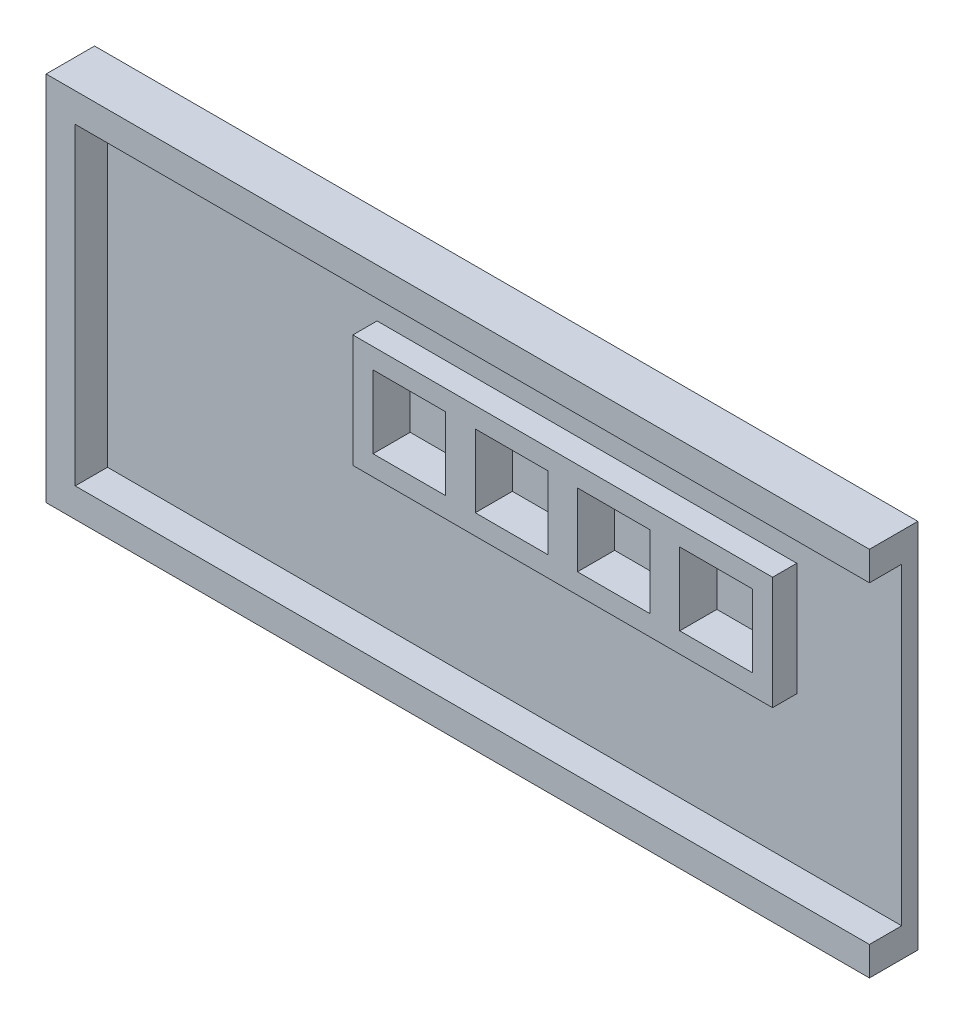
ISO-10303-21;
HEADER;
FILE_DESCRIPTION(('STEP AP214'),'2;1');
FILE_NAME('part.step','',(''),(''),'','','');
FILE_SCHEMA(('AUTOMOTIVE_DESIGN { 1 0 10303 214 1 1 1 1 }'));
ENDSEC;
DATA;
#1=APPLICATION_CONTEXT('core data for automotive mechanical design processes');
#2=APPLICATION_PROTOCOL_DEFINITION('international standard','automotive_design',2000,#1);
#3=PRODUCT_CONTEXT('',#1,'mechanical');
#4=PRODUCT('Part','Part','',(#3));
#5=PRODUCT_RELATED_PRODUCT_CATEGORY('part','',(#4));
#6=PRODUCT_DEFINITION_FORMATION('','',#4);
#7=PRODUCT_DEFINITION_CONTEXT('part definition',#1,'design');
#8=PRODUCT_DEFINITION('design','',#6,#7);
#9=PRODUCT_DEFINITION_SHAPE('','',#8);
#10=(LENGTH_UNIT() NAMED_UNIT(*) SI_UNIT(.MILLI.,.METRE.));
#11=(NAMED_UNIT(*) PLANE_ANGLE_UNIT() SI_UNIT($,.RADIAN.));
#12=(NAMED_UNIT(*) SI_UNIT($,.STERADIAN.) SOLID_ANGLE_UNIT());
#13=UNCERTAINTY_MEASURE_WITH_UNIT(LENGTH_MEASURE(1.E-05),#10,'distance_accuracy_value','');
#14=(GEOMETRIC_REPRESENTATION_CONTEXT(3) GLOBAL_UNCERTAINTY_ASSIGNED_CONTEXT((#13)) GLOBAL_UNIT_ASSIGNED_CONTEXT((#10,
#11,#12)) REPRESENTATION_CONTEXT('',''));
#15=CARTESIAN_POINT('',(0.,0.,0.));
#16=DIRECTION('',(0.,0.,1.));
#17=DIRECTION('',(1.,0.,0.));
#18=AXIS2_PLACEMENT_3D('',#15,#16,#17);
#19=CARTESIAN_POINT('',(0.,0.,1.));
#20=DIRECTION('',(0.,0.,1.));
#21=DIRECTION('',(1.,0.,0.));
#22=AXIS2_PLACEMENT_3D('',#19,#20,#21);
#23=PLANE('',#22);
#24=DIRECTION('',(1.,0.,0.));
#25=VECTOR('',#24,1.);
#26=CARTESIAN_POINT('',(-49.2,21.2,1.));
#27=LINE('',#26,#25);
#28=CARTESIAN_POINT('',(-49.2,21.2,1.));
#29=VERTEX_POINT('',#28);
#30=CARTESIAN_POINT('',(0.,21.2,1.));
#31=VERTEX_POINT('',#30);
#32=EDGE_CURVE('E386',#29,#31,#27,.T.);
#33=ORIENTED_EDGE('',*,*,#32,.F.);
#34=DIRECTION('',(0.,1.,0.));
#35=VECTOR('',#34,1.);
#36=CARTESIAN_POINT('',(-49.2,21.2,1.));
#37=LINE('',#36,#35);
#38=CARTESIAN_POINT('',(-49.2,1.8,1.));
#39=VERTEX_POINT('',#38);
#40=EDGE_CURVE('E406',#39,#29,#37,.T.);
#41=ORIENTED_EDGE('',*,*,#40,.F.);
#42=DIRECTION('',(-1.,0.,0.));
#43=VECTOR('',#42,1.);
#44=CARTESIAN_POINT('',(-49.2,1.8,1.));
#45=LINE('',#44,#43);
#46=CARTESIAN_POINT('',(0.,1.8,1.));
#47=VERTEX_POINT('',#46);
#48=EDGE_CURVE('E381',#47,#39,#45,.T.);
#49=ORIENTED_EDGE('',*,*,#48,.F.);
#50=DIRECTION('',(0.,1.,0.));
#51=VECTOR('',#50,1.);
#52=CARTESIAN_POINT('',(0.,0.,1.));
#53=LINE('',#52,#51);
#54=EDGE_CURVE('E423',#47,#31,#53,.T.);
#55=ORIENTED_EDGE('',*,*,#54,.T.);
#56=EDGE_LOOP('',(#33,#41,#49,#55));
#57=FACE_BOUND('',#56,.T.);
#58=DIRECTION('',(1.,0.,0.));
#59=VECTOR('',#58,1.);
#60=CARTESIAN_POINT('',(-32.5,11.,1.));
#61=LINE('',#60,#59);
#62=CARTESIAN_POINT('',(-32.5,11.,1.));
#63=VERTEX_POINT('',#62);
#64=CARTESIAN_POINT('',(-6.5,11.,1.));
#65=VERTEX_POINT('',#64);
#66=EDGE_CURVE('E366',#63,#65,#61,.T.);
#67=ORIENTED_EDGE('',*,*,#66,.F.);
#68=DIRECTION('',(0.,-1.,0.));
#69=VECTOR('',#68,1.);
#70=CARTESIAN_POINT('',(-32.5,18.,1.));
#71=LINE('',#70,#69);
#72=CARTESIAN_POINT('',(-32.5,18.,1.));
#73=VERTEX_POINT('',#72);
#74=EDGE_CURVE('E346',#73,#63,#71,.T.);
#75=ORIENTED_EDGE('',*,*,#74,.F.);
#76=DIRECTION('',(-1.,0.,0.));
#77=VECTOR('',#76,1.);
#78=CARTESIAN_POINT('',(-32.5,18.,1.));
#79=LINE('',#78,#77);
#80=CARTESIAN_POINT('',(-6.5,18.,1.));
#81=VERTEX_POINT('',#80);
#82=EDGE_CURVE('E357',#81,#73,#79,.T.);
#83=ORIENTED_EDGE('',*,*,#82,.F.);
#84=DIRECTION('',(0.,1.,0.));
#85=VECTOR('',#84,1.);
#86=CARTESIAN_POINT('',(-6.5,18.,1.));
#87=LINE('',#86,#85);
#88=EDGE_CURVE('E368',#65,#81,#87,.T.);
#89=ORIENTED_EDGE('',*,*,#88,.F.);
#90=EDGE_LOOP('',(#67,#75,#83,#89));
#91=FACE_BOUND('',#90,.T.);
#92=ADVANCED_FACE('F35',(#57,#91),#23,.T.);
#93=CARTESIAN_POINT('',(0.,0.,1.));
#94=DIRECTION('',(-1.,0.,0.));
#95=DIRECTION('',(0.,0.,1.));
#96=AXIS2_PLACEMENT_3D('',#93,#94,#95);
#97=PLANE('',#96);
#98=DIRECTION('',(0.,1.,0.));
#99=VECTOR('',#98,1.);
#100=CARTESIAN_POINT('',(0.,0.,0.));
#101=LINE('',#100,#99);
#102=CARTESIAN_POINT('',(0.,0.,0.));
#103=VERTEX_POINT('',#102);
#104=CARTESIAN_POINT('',(0.,23.,0.));
#105=VERTEX_POINT('',#104);
#106=EDGE_CURVE('E422',#103,#105,#101,.T.);
#107=ORIENTED_EDGE('',*,*,#106,.T.);
#108=DIRECTION('',(0.,0.,-1.));
#109=VECTOR('',#108,1.);
#110=CARTESIAN_POINT('',(0.,23.,1.));
#111=LINE('',#110,#109);
#112=CARTESIAN_POINT('',(0.,23.,3.));
#113=VERTEX_POINT('',#112);
#114=EDGE_CURVE('E11',#113,#105,#111,.T.);
#115=ORIENTED_EDGE('',*,*,#114,.F.);
#116=DIRECTION('',(0.,1.,0.));
#117=VECTOR('',#116,1.);
#118=CARTESIAN_POINT('',(0.,23.,3.));
#119=LINE('',#118,#117);
#120=CARTESIAN_POINT('',(0.,21.2,3.));
#121=VERTEX_POINT('',#120);
#122=EDGE_CURVE('E397',#121,#113,#119,.T.);
#123=ORIENTED_EDGE('',*,*,#122,.F.);
#124=DIRECTION('',(0.,0.,-1.));
#125=VECTOR('',#124,1.);
#126=CARTESIAN_POINT('',(0.,21.2,3.));
#127=LINE('',#126,#125);
#128=EDGE_CURVE('E403',#121,#31,#127,.T.);
#129=ORIENTED_EDGE('',*,*,#128,.T.);
#130=ORIENTED_EDGE('',*,*,#54,.F.);
#131=DIRECTION('',(0.,0.,-1.));
#132=VECTOR('',#131,1.);
#133=CARTESIAN_POINT('',(0.,1.8,3.));
#134=LINE('',#133,#132);
#135=CARTESIAN_POINT('',(0.,1.8,3.));
#136=VERTEX_POINT('',#135);
#137=EDGE_CURVE('E419',#136,#47,#134,.T.);
#138=ORIENTED_EDGE('',*,*,#137,.F.);
#139=DIRECTION('',(0.,1.,0.));
#140=VECTOR('',#139,1.);
#141=CARTESIAN_POINT('',(0.,0.,3.));
#142=LINE('',#141,#140);
#143=CARTESIAN_POINT('',(0.,0.,3.));
#144=VERTEX_POINT('',#143);
#145=EDGE_CURVE('E389',#144,#136,#142,.T.);
#146=ORIENTED_EDGE('',*,*,#145,.F.);
#147=DIRECTION('',(0.,0.,-1.));
#148=VECTOR('',#147,1.);
#149=CARTESIAN_POINT('',(0.,0.,1.));
#150=LINE('',#149,#148);
#151=EDGE_CURVE('E425',#144,#103,#150,.T.);
#152=ORIENTED_EDGE('',*,*,#151,.T.);
#153=EDGE_LOOP('',(#107,#115,#123,#129,#130,#138,#146,#152));
#154=FACE_BOUND('',#153,.T.);
#155=ADVANCED_FACE('F37',(#154),#97,.F.);
#156=CARTESIAN_POINT('',(0.,23.,1.));
#157=DIRECTION('',(0.,-1.,0.));
#158=DIRECTION('',(0.,0.,-1.));
#159=AXIS2_PLACEMENT_3D('',#156,#157,#158);
#160=PLANE('',#159);
#161=DIRECTION('',(-1.,0.,0.));
#162=VECTOR('',#161,1.);
#163=CARTESIAN_POINT('',(0.,23.,0.));
#164=LINE('',#163,#162);
#165=CARTESIAN_POINT('',(-51.,23.,0.));
#166=VERTEX_POINT('',#165);
#167=EDGE_CURVE('E429',#105,#166,#164,.T.);
#168=ORIENTED_EDGE('',*,*,#167,.T.);
#169=DIRECTION('',(0.,0.,-1.));
#170=VECTOR('',#169,1.);
#171=CARTESIAN_POINT('',(-51.,23.,1.));
#172=LINE('',#171,#170);
#173=CARTESIAN_POINT('',(-51.,23.,3.));
#174=VERTEX_POINT('',#173);
#175=EDGE_CURVE('E43',#174,#166,#172,.T.);
#176=ORIENTED_EDGE('',*,*,#175,.F.);
#177=DIRECTION('',(-1.,0.,0.));
#178=VECTOR('',#177,1.);
#179=CARTESIAN_POINT('',(-51.,23.,3.));
#180=LINE('',#179,#178);
#181=EDGE_CURVE('E400',#113,#174,#180,.T.);
#182=ORIENTED_EDGE('',*,*,#181,.F.);
#183=ORIENTED_EDGE('',*,*,#114,.T.);
#184=EDGE_LOOP('',(#168,#176,#182,#183));
#185=FACE_BOUND('',#184,.T.);
#186=ADVANCED_FACE('F461',(#185),#160,.F.);
#187=CARTESIAN_POINT('',(-51.,0.,1.));
#188=DIRECTION('',(1.,0.,0.));
#189=DIRECTION('',(0.,0.,-1.));
#190=AXIS2_PLACEMENT_3D('',#187,#188,#189);
#191=PLANE('',#190);
#192=DIRECTION('',(0.,-1.,0.));
#193=VECTOR('',#192,1.);
#194=CARTESIAN_POINT('',(-51.,0.,0.));
#195=LINE('',#194,#193);
#196=CARTESIAN_POINT('',(-51.,0.,0.));
#197=VERTEX_POINT('',#196);
#198=EDGE_CURVE('E431',#166,#197,#195,.T.);
#199=ORIENTED_EDGE('',*,*,#198,.T.);
#200=DIRECTION('',(0.,0.,-1.));
#201=VECTOR('',#200,1.);
#202=CARTESIAN_POINT('',(-51.,0.,1.));
#203=LINE('',#202,#201);
#204=CARTESIAN_POINT('',(-51.,0.,3.));
#205=VERTEX_POINT('',#204);
#206=EDGE_CURVE('E436',#205,#197,#203,.T.);
#207=ORIENTED_EDGE('',*,*,#206,.F.);
#208=DIRECTION('',(0.,-1.,0.));
#209=VECTOR('',#208,1.);
#210=CARTESIAN_POINT('',(-51.,23.,3.));
#211=LINE('',#210,#209);
#212=EDGE_CURVE('E382',#174,#205,#211,.T.);
#213=ORIENTED_EDGE('',*,*,#212,.F.);
#214=ORIENTED_EDGE('',*,*,#175,.T.);
#215=EDGE_LOOP('',(#199,#207,#213,#214));
#216=FACE_BOUND('',#215,.T.);
#217=ADVANCED_FACE('F442',(#216),#191,.F.);
#218=CARTESIAN_POINT('',(0.,0.,1.));
#219=DIRECTION('',(0.,1.,0.));
#220=DIRECTION('',(0.,0.,1.));
#221=AXIS2_PLACEMENT_3D('',#218,#219,#220);
#222=PLANE('',#221);
#223=DIRECTION('',(1.,0.,0.));
#224=VECTOR('',#223,1.);
#225=CARTESIAN_POINT('',(0.,0.,0.));
#226=LINE('',#225,#224);
#227=EDGE_CURVE('E426',#197,#103,#226,.T.);
#228=ORIENTED_EDGE('',*,*,#227,.T.);
#229=ORIENTED_EDGE('',*,*,#151,.F.);
#230=DIRECTION('',(1.,0.,0.));
#231=VECTOR('',#230,1.);
#232=CARTESIAN_POINT('',(-51.,0.,3.));
#233=LINE('',#232,#231);
#234=EDGE_CURVE('E385',#205,#144,#233,.T.);
#235=ORIENTED_EDGE('',*,*,#234,.F.);
#236=ORIENTED_EDGE('',*,*,#206,.T.);
#237=EDGE_LOOP('',(#228,#229,#235,#236));
#238=FACE_BOUND('',#237,.T.);
#239=ADVANCED_FACE('F450',(#238),#222,.F.);
#240=CARTESIAN_POINT('',(0.,0.,0.));
#241=DIRECTION('',(0.,0.,1.));
#242=DIRECTION('',(1.,0.,0.));
#243=AXIS2_PLACEMENT_3D('',#240,#241,#242);
#244=PLANE('',#243);
#245=ORIENTED_EDGE('',*,*,#106,.F.);
#246=ORIENTED_EDGE('',*,*,#227,.F.);
#247=ORIENTED_EDGE('',*,*,#198,.F.);
#248=ORIENTED_EDGE('',*,*,#167,.F.);
#249=EDGE_LOOP('',(#245,#246,#247,#248));
#250=FACE_BOUND('',#249,.T.);
#251=ADVANCED_FACE('F448',(#250),#244,.F.);
#252=CARTESIAN_POINT('',(-49.2,1.8,3.));
#253=DIRECTION('',(0.,-1.,0.));
#254=DIRECTION('',(0.,0.,-1.));
#255=AXIS2_PLACEMENT_3D('',#252,#253,#254);
#256=PLANE('',#255);
#257=ORIENTED_EDGE('',*,*,#48,.T.);
#258=DIRECTION('',(0.,0.,-1.));
#259=VECTOR('',#258,1.);
#260=CARTESIAN_POINT('',(-49.2,1.8,3.));
#261=LINE('',#260,#259);
#262=CARTESIAN_POINT('',(-49.2,1.8,3.));
#263=VERTEX_POINT('',#262);
#264=EDGE_CURVE('E416',#263,#39,#261,.T.);
#265=ORIENTED_EDGE('',*,*,#264,.F.);
#266=DIRECTION('',(-1.,0.,0.));
#267=VECTOR('',#266,1.);
#268=CARTESIAN_POINT('',(-49.2,1.8,3.));
#269=LINE('',#268,#267);
#270=EDGE_CURVE('E391',#136,#263,#269,.T.);
#271=ORIENTED_EDGE('',*,*,#270,.F.);
#272=ORIENTED_EDGE('',*,*,#137,.T.);
#273=EDGE_LOOP('',(#257,#265,#271,#272));
#274=FACE_BOUND('',#273,.T.);
#275=ADVANCED_FACE('F473',(#274),#256,.F.);
#276=CARTESIAN_POINT('',(-49.2,21.2,3.));
#277=DIRECTION('',(-1.,0.,0.));
#278=DIRECTION('',(0.,0.,1.));
#279=AXIS2_PLACEMENT_3D('',#276,#277,#278);
#280=PLANE('',#279);
#281=ORIENTED_EDGE('',*,*,#40,.T.);
#282=DIRECTION('',(0.,0.,-1.));
#283=VECTOR('',#282,1.);
#284=CARTESIAN_POINT('',(-49.2,21.2,3.));
#285=LINE('',#284,#283);
#286=CARTESIAN_POINT('',(-49.2,21.2,3.));
#287=VERTEX_POINT('',#286);
#288=EDGE_CURVE('E413',#287,#29,#285,.T.);
#289=ORIENTED_EDGE('',*,*,#288,.F.);
#290=DIRECTION('',(0.,1.,0.));
#291=VECTOR('',#290,1.);
#292=CARTESIAN_POINT('',(-49.2,21.2,3.));
#293=LINE('',#292,#291);
#294=EDGE_CURVE('E393',#263,#287,#293,.T.);
#295=ORIENTED_EDGE('',*,*,#294,.F.);
#296=ORIENTED_EDGE('',*,*,#264,.T.);
#297=EDGE_LOOP('',(#281,#289,#295,#296));
#298=FACE_BOUND('',#297,.T.);
#299=ADVANCED_FACE('F470',(#298),#280,.F.);
#300=CARTESIAN_POINT('',(-49.2,21.2,3.));
#301=DIRECTION('',(0.,1.,0.));
#302=DIRECTION('',(0.,0.,1.));
#303=AXIS2_PLACEMENT_3D('',#300,#301,#302);
#304=PLANE('',#303);
#305=ORIENTED_EDGE('',*,*,#32,.T.);
#306=ORIENTED_EDGE('',*,*,#128,.F.);
#307=DIRECTION('',(1.,0.,0.));
#308=VECTOR('',#307,1.);
#309=CARTESIAN_POINT('',(-49.2,21.2,3.));
#310=LINE('',#309,#308);
#311=EDGE_CURVE('E395',#287,#121,#310,.T.);
#312=ORIENTED_EDGE('',*,*,#311,.F.);
#313=ORIENTED_EDGE('',*,*,#288,.T.);
#314=EDGE_LOOP('',(#305,#306,#312,#313));
#315=FACE_BOUND('',#314,.T.);
#316=ADVANCED_FACE('F465',(#315),#304,.F.);
#317=CARTESIAN_POINT('',(0.,0.,3.));
#318=DIRECTION('',(0.,0.,1.));
#319=DIRECTION('',(1.,0.,0.));
#320=AXIS2_PLACEMENT_3D('',#317,#318,#319);
#321=PLANE('',#320);
#322=ORIENTED_EDGE('',*,*,#212,.T.);
#323=ORIENTED_EDGE('',*,*,#234,.T.);
#324=ORIENTED_EDGE('',*,*,#145,.T.);
#325=ORIENTED_EDGE('',*,*,#270,.T.);
#326=ORIENTED_EDGE('',*,*,#294,.T.);
#327=ORIENTED_EDGE('',*,*,#311,.T.);
#328=ORIENTED_EDGE('',*,*,#122,.T.);
#329=ORIENTED_EDGE('',*,*,#181,.T.);
#330=EDGE_LOOP('',(#322,#323,#324,#325,#326,#327,#328,#329));
#331=FACE_BOUND('',#330,.T.);
#332=ADVANCED_FACE('F458',(#331),#321,.T.);
#333=CARTESIAN_POINT('',(-32.5,18.,2.5));
#334=DIRECTION('',(1.,0.,0.));
#335=DIRECTION('',(0.,0.,-1.));
#336=AXIS2_PLACEMENT_3D('',#333,#334,#335);
#337=PLANE('',#336);
#338=ORIENTED_EDGE('',*,*,#74,.T.);
#339=DIRECTION('',(0.,0.,-1.));
#340=VECTOR('',#339,1.);
#341=CARTESIAN_POINT('',(-32.5,11.,2.5));
#342=LINE('',#341,#340);
#343=CARTESIAN_POINT('',(-32.5,11.,2.5));
#344=VERTEX_POINT('',#343);
#345=EDGE_CURVE('E379',#344,#63,#342,.T.);
#346=ORIENTED_EDGE('',*,*,#345,.F.);
#347=DIRECTION('',(0.,-1.,0.));
#348=VECTOR('',#347,1.);
#349=CARTESIAN_POINT('',(-32.5,18.,2.5));
#350=LINE('',#349,#348);
#351=CARTESIAN_POINT('',(-32.5,18.,2.5));
#352=VERTEX_POINT('',#351);
#353=EDGE_CURVE('E353',#352,#344,#350,.T.);
#354=ORIENTED_EDGE('',*,*,#353,.F.);
#355=DIRECTION('',(0.,0.,-1.));
#356=VECTOR('',#355,1.);
#357=CARTESIAN_POINT('',(-32.5,18.,2.5));
#358=LINE('',#357,#356);
#359=EDGE_CURVE('E363',#352,#73,#358,.T.);
#360=ORIENTED_EDGE('',*,*,#359,.T.);
#361=EDGE_LOOP('',(#338,#346,#354,#360));
#362=FACE_BOUND('',#361,.T.);
#363=ADVANCED_FACE('F563',(#362),#337,.F.);
#364=CARTESIAN_POINT('',(-32.5,11.,2.5));
#365=DIRECTION('',(0.,1.,0.));
#366=DIRECTION('',(0.,0.,1.));
#367=AXIS2_PLACEMENT_3D('',#364,#365,#366);
#368=PLANE('',#367);
#369=ORIENTED_EDGE('',*,*,#66,.T.);
#370=DIRECTION('',(0.,0.,-1.));
#371=VECTOR('',#370,1.);
#372=CARTESIAN_POINT('',(-6.5,11.,2.5));
#373=LINE('',#372,#371);
#374=CARTESIAN_POINT('',(-6.5,11.,2.5));
#375=VERTEX_POINT('',#374);
#376=EDGE_CURVE('E376',#375,#65,#373,.T.);
#377=ORIENTED_EDGE('',*,*,#376,.F.);
#378=DIRECTION('',(1.,0.,0.));
#379=VECTOR('',#378,1.);
#380=CARTESIAN_POINT('',(-32.5,11.,2.5));
#381=LINE('',#380,#379);
#382=EDGE_CURVE('E356',#344,#375,#381,.T.);
#383=ORIENTED_EDGE('',*,*,#382,.F.);
#384=ORIENTED_EDGE('',*,*,#345,.T.);
#385=EDGE_LOOP('',(#369,#377,#383,#384));
#386=FACE_BOUND('',#385,.T.);
#387=ADVANCED_FACE('F575',(#386),#368,.F.);
#388=CARTESIAN_POINT('',(-6.5,18.,2.5));
#389=DIRECTION('',(-1.,0.,0.));
#390=DIRECTION('',(0.,0.,1.));
#391=AXIS2_PLACEMENT_3D('',#388,#389,#390);
#392=PLANE('',#391);
#393=ORIENTED_EDGE('',*,*,#88,.T.);
#394=DIRECTION('',(0.,0.,-1.));
#395=VECTOR('',#394,1.);
#396=CARTESIAN_POINT('',(-6.5,18.,2.5));
#397=LINE('',#396,#395);
#398=CARTESIAN_POINT('',(-6.5,18.,2.5));
#399=VERTEX_POINT('',#398);
#400=EDGE_CURVE('E374',#399,#81,#397,.T.);
#401=ORIENTED_EDGE('',*,*,#400,.F.);
#402=DIRECTION('',(0.,1.,0.));
#403=VECTOR('',#402,1.);
#404=CARTESIAN_POINT('',(-6.5,18.,2.5));
#405=LINE('',#404,#403);
#406=EDGE_CURVE('E359',#375,#399,#405,.T.);
#407=ORIENTED_EDGE('',*,*,#406,.F.);
#408=ORIENTED_EDGE('',*,*,#376,.T.);
#409=EDGE_LOOP('',(#393,#401,#407,#408));
#410=FACE_BOUND('',#409,.T.);
#411=ADVANCED_FACE('F584',(#410),#392,.F.);
#412=CARTESIAN_POINT('',(-32.5,18.,2.5));
#413=DIRECTION('',(0.,-1.,0.));
#414=DIRECTION('',(0.,0.,-1.));
#415=AXIS2_PLACEMENT_3D('',#412,#413,#414);
#416=PLANE('',#415);
#417=ORIENTED_EDGE('',*,*,#82,.T.);
#418=ORIENTED_EDGE('',*,*,#359,.F.);
#419=DIRECTION('',(-1.,0.,0.));
#420=VECTOR('',#419,1.);
#421=CARTESIAN_POINT('',(-32.5,18.,2.5));
#422=LINE('',#421,#420);
#423=EDGE_CURVE('E361',#399,#352,#422,.T.);
#424=ORIENTED_EDGE('',*,*,#423,.F.);
#425=ORIENTED_EDGE('',*,*,#400,.T.);
#426=EDGE_LOOP('',(#417,#418,#424,#425));
#427=FACE_BOUND('',#426,.T.);
#428=ADVANCED_FACE('F593',(#427),#416,.F.);
#429=CARTESIAN_POINT('',(0.,0.,2.5));
#430=DIRECTION('',(0.,0.,1.));
#431=DIRECTION('',(1.,0.,0.));
#432=AXIS2_PLACEMENT_3D('',#429,#430,#431);
#433=PLANE('',#432);
#434=DIRECTION('',(0.,-1.,0.));
#435=VECTOR('',#434,1.);
#436=CARTESIAN_POINT('',(-24.9166666666667,16.75,2.5));
#437=LINE('',#436,#435);
#438=CARTESIAN_POINT('',(-24.9166666666667,16.75,2.5));
#439=VERTEX_POINT('',#438);
#440=CARTESIAN_POINT('',(-24.9166666666667,12.25,2.5));
#441=VERTEX_POINT('',#440);
#442=EDGE_CURVE('E50',#439,#441,#437,.T.);
#443=ORIENTED_EDGE('',*,*,#442,.F.);
#444=DIRECTION('',(-1.,0.,0.));
#445=VECTOR('',#444,1.);
#446=CARTESIAN_POINT('',(-24.9166666666667,16.75,2.5));
#447=LINE('',#446,#445);
#448=CARTESIAN_POINT('',(-20.4166666666667,16.75,2.5));
#449=VERTEX_POINT('',#448);
#450=EDGE_CURVE('E240',#449,#439,#447,.T.);
#451=ORIENTED_EDGE('',*,*,#450,.F.);
#452=DIRECTION('',(0.,1.,0.));
#453=VECTOR('',#452,1.);
#454=CARTESIAN_POINT('',(-20.4166666666667,16.75,2.5));
#455=LINE('',#454,#453);
#456=CARTESIAN_POINT('',(-20.4166666666667,12.25,2.5));
#457=VERTEX_POINT('',#456);
#458=EDGE_CURVE('E243',#457,#449,#455,.T.);
#459=ORIENTED_EDGE('',*,*,#458,.F.);
#460=DIRECTION('',(1.,0.,0.));
#461=VECTOR('',#460,1.);
#462=CARTESIAN_POINT('',(-24.9166666666667,12.25,2.5));
#463=LINE('',#462,#461);
#464=EDGE_CURVE('E249',#441,#457,#463,.T.);
#465=ORIENTED_EDGE('',*,*,#464,.F.);
#466=EDGE_LOOP('',(#443,#451,#459,#465));
#467=FACE_BOUND('',#466,.T.);
#468=DIRECTION('',(0.,-1.,0.));
#469=VECTOR('',#468,1.);
#470=CARTESIAN_POINT('',(-18.5833333333333,16.75,2.5));
#471=LINE('',#470,#469);
#472=CARTESIAN_POINT('',(-18.5833333333333,16.75,2.5));
#473=VERTEX_POINT('',#472);
#474=CARTESIAN_POINT('',(-18.5833333333333,12.25,2.5));
#475=VERTEX_POINT('',#474);
#476=EDGE_CURVE('E58',#473,#475,#471,.T.);
#477=ORIENTED_EDGE('',*,*,#476,.F.);
#478=DIRECTION('',(-1.,0.,0.));
#479=VECTOR('',#478,1.);
#480=CARTESIAN_POINT('',(-18.5833333333333,16.75,2.5));
#481=LINE('',#480,#479);
#482=CARTESIAN_POINT('',(-14.0833333333333,16.75,2.5));
#483=VERTEX_POINT('',#482);
#484=EDGE_CURVE('E264',#483,#473,#481,.T.);
#485=ORIENTED_EDGE('',*,*,#484,.F.);
#486=DIRECTION('',(0.,1.,0.));
#487=VECTOR('',#486,1.);
#488=CARTESIAN_POINT('',(-14.0833333333333,16.75,2.5));
#489=LINE('',#488,#487);
#490=CARTESIAN_POINT('',(-14.0833333333333,12.25,2.5));
#491=VERTEX_POINT('',#490);
#492=EDGE_CURVE('E279',#491,#483,#489,.T.);
#493=ORIENTED_EDGE('',*,*,#492,.F.);
#494=DIRECTION('',(1.,0.,0.));
#495=VECTOR('',#494,1.);
#496=CARTESIAN_POINT('',(-18.5833333333333,12.25,2.5));
#497=LINE('',#496,#495);
#498=EDGE_CURVE('E275',#475,#491,#497,.T.);
#499=ORIENTED_EDGE('',*,*,#498,.F.);
#500=EDGE_LOOP('',(#477,#485,#493,#499));
#501=FACE_BOUND('',#500,.T.);
#502=DIRECTION('',(0.,-1.,0.));
#503=VECTOR('',#502,1.);
#504=CARTESIAN_POINT('',(-12.25,16.75,2.5));
#505=LINE('',#504,#503);
#506=CARTESIAN_POINT('',(-12.25,16.75,2.5));
#507=VERTEX_POINT('',#506);
#508=CARTESIAN_POINT('',(-12.25,12.25,2.5));
#509=VERTEX_POINT('',#508);
#510=EDGE_CURVE('E304',#507,#509,#505,.T.);
#511=ORIENTED_EDGE('',*,*,#510,.F.);
#512=DIRECTION('',(-1.,0.,0.));
#513=VECTOR('',#512,1.);
#514=CARTESIAN_POINT('',(-12.25,16.75,2.5));
#515=LINE('',#514,#513);
#516=CARTESIAN_POINT('',(-7.75,16.75,2.5));
#517=VERTEX_POINT('',#516);
#518=EDGE_CURVE('E294',#517,#507,#515,.T.);
#519=ORIENTED_EDGE('',*,*,#518,.F.);
#520=DIRECTION('',(0.,1.,0.));
#521=VECTOR('',#520,1.);
#522=CARTESIAN_POINT('',(-7.75,16.75,2.5));
#523=LINE('',#522,#521);
#524=CARTESIAN_POINT('',(-7.75,12.25,2.5));
#525=VERTEX_POINT('',#524);
#526=EDGE_CURVE('E309',#525,#517,#523,.T.);
#527=ORIENTED_EDGE('',*,*,#526,.F.);
#528=DIRECTION('',(1.,0.,0.));
#529=VECTOR('',#528,1.);
#530=CARTESIAN_POINT('',(-12.25,12.25,2.5));
#531=LINE('',#530,#529);
#532=EDGE_CURVE('E306',#509,#525,#531,.T.);
#533=ORIENTED_EDGE('',*,*,#532,.F.);
#534=EDGE_LOOP('',(#511,#519,#527,#533));
#535=FACE_BOUND('',#534,.T.);
#536=DIRECTION('',(0.,-1.,0.));
#537=VECTOR('',#536,1.);
#538=CARTESIAN_POINT('',(-31.25,16.75,2.5));
#539=LINE('',#538,#537);
#540=CARTESIAN_POINT('',(-31.25,16.75,2.5));
#541=VERTEX_POINT('',#540);
#542=CARTESIAN_POINT('',(-31.25,12.25,2.5));
#543=VERTEX_POINT('',#542);
#544=EDGE_CURVE('E256',#541,#543,#539,.T.);
#545=ORIENTED_EDGE('',*,*,#544,.F.);
#546=DIRECTION('',(-1.,0.,0.));
#547=VECTOR('',#546,1.);
#548=CARTESIAN_POINT('',(-31.25,16.75,2.5));
#549=LINE('',#548,#547);
#550=CARTESIAN_POINT('',(-26.75,16.75,2.5));
#551=VERTEX_POINT('',#550);
#552=EDGE_CURVE('E325',#551,#541,#549,.T.);
#553=ORIENTED_EDGE('',*,*,#552,.F.);
#554=DIRECTION('',(0.,1.,0.));
#555=VECTOR('',#554,1.);
#556=CARTESIAN_POINT('',(-26.75,16.75,2.5));
#557=LINE('',#556,#555);
#558=CARTESIAN_POINT('',(-26.75,12.25,2.5));
#559=VERTEX_POINT('',#558);
#560=EDGE_CURVE('E339',#559,#551,#557,.T.);
#561=ORIENTED_EDGE('',*,*,#560,.F.);
#562=DIRECTION('',(1.,0.,0.));
#563=VECTOR('',#562,1.);
#564=CARTESIAN_POINT('',(-31.25,12.25,2.5));
#565=LINE('',#564,#563);
#566=EDGE_CURVE('E336',#543,#559,#565,.T.);
#567=ORIENTED_EDGE('',*,*,#566,.F.);
#568=EDGE_LOOP('',(#545,#553,#561,#567));
#569=FACE_BOUND('',#568,.T.);
#570=ORIENTED_EDGE('',*,*,#353,.T.);
#571=ORIENTED_EDGE('',*,*,#382,.T.);
#572=ORIENTED_EDGE('',*,*,#406,.T.);
#573=ORIENTED_EDGE('',*,*,#423,.T.);
#574=EDGE_LOOP('',(#570,#571,#572,#573));
#575=FACE_BOUND('',#574,.T.);
#576=ADVANCED_FACE('F602',(#467,#501,#535,#569,#575),#433,.T.);
#577=CARTESIAN_POINT('',(-31.25,16.75,0.2));
#578=DIRECTION('',(-1.,0.,0.));
#579=DIRECTION('',(0.,0.,1.));
#580=AXIS2_PLACEMENT_3D('',#577,#578,#579);
#581=PLANE('',#580);
#582=ORIENTED_EDGE('',*,*,#544,.T.);
#583=DIRECTION('',(0.,0.,1.));
#584=VECTOR('',#583,1.);
#585=CARTESIAN_POINT('',(-31.25,12.25,0.2));
#586=LINE('',#585,#584);
#587=CARTESIAN_POINT('',(-31.25,12.25,0.2));
#588=VERTEX_POINT('',#587);
#589=EDGE_CURVE('E334',#588,#543,#586,.T.);
#590=ORIENTED_EDGE('',*,*,#589,.F.);
#591=DIRECTION('',(0.,-1.,0.));
#592=VECTOR('',#591,1.);
#593=CARTESIAN_POINT('',(-31.25,16.75,0.2));
#594=LINE('',#593,#592);
#595=CARTESIAN_POINT('',(-31.25,16.75,0.2));
#596=VERTEX_POINT('',#595);
#597=EDGE_CURVE('E321',#596,#588,#594,.T.);
#598=ORIENTED_EDGE('',*,*,#597,.F.);
#599=DIRECTION('',(0.,0.,1.));
#600=VECTOR('',#599,1.);
#601=CARTESIAN_POINT('',(-31.25,16.75,0.2));
#602=LINE('',#601,#600);
#603=EDGE_CURVE('E344',#596,#541,#602,.T.);
#604=ORIENTED_EDGE('',*,*,#603,.T.);
#605=EDGE_LOOP('',(#582,#590,#598,#604));
#606=FACE_BOUND('',#605,.T.);
#607=ADVANCED_FACE('F611',(#606),#581,.F.);
#608=CARTESIAN_POINT('',(-31.25,16.75,0.2));
#609=DIRECTION('',(0.,1.,0.));
#610=DIRECTION('',(0.,0.,1.));
#611=AXIS2_PLACEMENT_3D('',#608,#609,#610);
#612=PLANE('',#611);
#613=ORIENTED_EDGE('',*,*,#552,.T.);
#614=ORIENTED_EDGE('',*,*,#603,.F.);
#615=DIRECTION('',(-1.,0.,0.));
#616=VECTOR('',#615,1.);
#617=CARTESIAN_POINT('',(-31.25,16.75,0.2));
#618=LINE('',#617,#616);
#619=CARTESIAN_POINT('',(-26.75,16.75,0.2));
#620=VERTEX_POINT('',#619);
#621=EDGE_CURVE('E331',#620,#596,#618,.T.);
#622=ORIENTED_EDGE('',*,*,#621,.F.);
#623=DIRECTION('',(0.,0.,1.));
#624=VECTOR('',#623,1.);
#625=CARTESIAN_POINT('',(-26.75,16.75,0.2));
#626=LINE('',#625,#624);
#627=EDGE_CURVE('E347',#620,#551,#626,.T.);
#628=ORIENTED_EDGE('',*,*,#627,.T.);
#629=EDGE_LOOP('',(#613,#614,#622,#628));
#630=FACE_BOUND('',#629,.T.);
#631=ADVANCED_FACE('F620',(#630),#612,.F.);
#632=CARTESIAN_POINT('',(-26.75,16.75,0.2));
#633=DIRECTION('',(1.,0.,0.));
#634=DIRECTION('',(0.,0.,-1.));
#635=AXIS2_PLACEMENT_3D('',#632,#633,#634);
#636=PLANE('',#635);
#637=ORIENTED_EDGE('',*,*,#560,.T.);
#638=ORIENTED_EDGE('',*,*,#627,.F.);
#639=DIRECTION('',(0.,1.,0.));
#640=VECTOR('',#639,1.);
#641=CARTESIAN_POINT('',(-26.75,16.75,0.2));
#642=LINE('',#641,#640);
#643=CARTESIAN_POINT('',(-26.75,12.25,0.2));
#644=VERTEX_POINT('',#643);
#645=EDGE_CURVE('E328',#644,#620,#642,.T.);
#646=ORIENTED_EDGE('',*,*,#645,.F.);
#647=DIRECTION('',(0.,0.,1.));
#648=VECTOR('',#647,1.);
#649=CARTESIAN_POINT('',(-26.75,12.25,0.2));
#650=LINE('',#649,#648);
#651=EDGE_CURVE('E349',#644,#559,#650,.T.);
#652=ORIENTED_EDGE('',*,*,#651,.T.);
#653=EDGE_LOOP('',(#637,#638,#646,#652));
#654=FACE_BOUND('',#653,.T.);
#655=ADVANCED_FACE('F629',(#654),#636,.F.);
#656=CARTESIAN_POINT('',(-31.25,12.25,0.2));
#657=DIRECTION('',(0.,-1.,0.));
#658=DIRECTION('',(0.,0.,-1.));
#659=AXIS2_PLACEMENT_3D('',#656,#657,#658);
#660=PLANE('',#659);
#661=ORIENTED_EDGE('',*,*,#566,.T.);
#662=ORIENTED_EDGE('',*,*,#651,.F.);
#663=DIRECTION('',(1.,0.,0.));
#664=VECTOR('',#663,1.);
#665=CARTESIAN_POINT('',(-31.25,12.25,0.2));
#666=LINE('',#665,#664);
#667=EDGE_CURVE('E324',#588,#644,#666,.T.);
#668=ORIENTED_EDGE('',*,*,#667,.F.);
#669=ORIENTED_EDGE('',*,*,#589,.T.);
#670=EDGE_LOOP('',(#661,#662,#668,#669));
#671=FACE_BOUND('',#670,.T.);
#672=ADVANCED_FACE('F638',(#671),#660,.F.);
#673=CARTESIAN_POINT('',(0.,0.,0.2));
#674=DIRECTION('',(0.,0.,1.));
#675=DIRECTION('',(1.,0.,0.));
#676=AXIS2_PLACEMENT_3D('',#673,#674,#675);
#677=PLANE('',#676);
#678=ORIENTED_EDGE('',*,*,#597,.T.);
#679=ORIENTED_EDGE('',*,*,#667,.T.);
#680=ORIENTED_EDGE('',*,*,#645,.T.);
#681=ORIENTED_EDGE('',*,*,#621,.T.);
#682=EDGE_LOOP('',(#678,#679,#680,#681));
#683=FACE_BOUND('',#682,.T.);
#684=ADVANCED_FACE('F647',(#683),#677,.T.);
#685=CARTESIAN_POINT('',(-12.25,16.75,0.2));
#686=DIRECTION('',(-1.,0.,0.));
#687=DIRECTION('',(0.,0.,1.));
#688=AXIS2_PLACEMENT_3D('',#685,#686,#687);
#689=PLANE('',#688);
#690=ORIENTED_EDGE('',*,*,#510,.T.);
#691=DIRECTION('',(0.,0.,1.));
#692=VECTOR('',#691,1.);
#693=CARTESIAN_POINT('',(-12.25,12.25,0.2));
#694=LINE('',#693,#692);
#695=CARTESIAN_POINT('',(-12.25,12.25,0.2));
#696=VERTEX_POINT('',#695);
#697=EDGE_CURVE('E303',#696,#509,#694,.T.);
#698=ORIENTED_EDGE('',*,*,#697,.F.);
#699=DIRECTION('',(0.,-1.,0.));
#700=VECTOR('',#699,1.);
#701=CARTESIAN_POINT('',(-12.25,16.75,0.2));
#702=LINE('',#701,#700);
#703=CARTESIAN_POINT('',(-12.25,16.75,0.2));
#704=VERTEX_POINT('',#703);
#705=EDGE_CURVE('E290',#704,#696,#702,.T.);
#706=ORIENTED_EDGE('',*,*,#705,.F.);
#707=DIRECTION('',(0.,0.,1.));
#708=VECTOR('',#707,1.);
#709=CARTESIAN_POINT('',(-12.25,16.75,0.2));
#710=LINE('',#709,#708);
#711=EDGE_CURVE('E276',#704,#507,#710,.T.);
#712=ORIENTED_EDGE('',*,*,#711,.T.);
#713=EDGE_LOOP('',(#690,#698,#706,#712));
#714=FACE_BOUND('',#713,.T.);
#715=ADVANCED_FACE('F656',(#714),#689,.F.);
#716=CARTESIAN_POINT('',(-12.25,16.75,0.2));
#717=DIRECTION('',(0.,1.,0.));
#718=DIRECTION('',(0.,0.,1.));
#719=AXIS2_PLACEMENT_3D('',#716,#717,#718);
#720=PLANE('',#719);
#721=ORIENTED_EDGE('',*,*,#518,.T.);
#722=ORIENTED_EDGE('',*,*,#711,.F.);
#723=DIRECTION('',(-1.,0.,0.));
#724=VECTOR('',#723,1.);
#725=CARTESIAN_POINT('',(-12.25,16.75,0.2));
#726=LINE('',#725,#724);
#727=CARTESIAN_POINT('',(-7.75,16.75,0.2));
#728=VERTEX_POINT('',#727);
#729=EDGE_CURVE('E300',#728,#704,#726,.T.);
#730=ORIENTED_EDGE('',*,*,#729,.F.);
#731=DIRECTION('',(0.,0.,1.));
#732=VECTOR('',#731,1.);
#733=CARTESIAN_POINT('',(-7.75,16.75,0.2));
#734=LINE('',#733,#732);
#735=EDGE_CURVE('E315',#728,#517,#734,.T.);
#736=ORIENTED_EDGE('',*,*,#735,.T.);
#737=EDGE_LOOP('',(#721,#722,#730,#736));
#738=FACE_BOUND('',#737,.T.);
#739=ADVANCED_FACE('F665',(#738),#720,.F.);
#740=CARTESIAN_POINT('',(-7.75,16.75,0.2));
#741=DIRECTION('',(1.,0.,0.));
#742=DIRECTION('',(0.,0.,-1.));
#743=AXIS2_PLACEMENT_3D('',#740,#741,#742);
#744=PLANE('',#743);
#745=ORIENTED_EDGE('',*,*,#526,.T.);
#746=ORIENTED_EDGE('',*,*,#735,.F.);
#747=DIRECTION('',(0.,1.,0.));
#748=VECTOR('',#747,1.);
#749=CARTESIAN_POINT('',(-7.75,16.75,0.2));
#750=LINE('',#749,#748);
#751=CARTESIAN_POINT('',(-7.75,12.25,0.2));
#752=VERTEX_POINT('',#751);
#753=EDGE_CURVE('E297',#752,#728,#750,.T.);
#754=ORIENTED_EDGE('',*,*,#753,.F.);
#755=DIRECTION('',(0.,0.,1.));
#756=VECTOR('',#755,1.);
#757=CARTESIAN_POINT('',(-7.75,12.25,0.2));
#758=LINE('',#757,#756);
#759=EDGE_CURVE('E317',#752,#525,#758,.T.);
#760=ORIENTED_EDGE('',*,*,#759,.T.);
#761=EDGE_LOOP('',(#745,#746,#754,#760));
#762=FACE_BOUND('',#761,.T.);
#763=ADVANCED_FACE('F674',(#762),#744,.F.);
#764=CARTESIAN_POINT('',(-12.25,12.25,0.2));
#765=DIRECTION('',(0.,-1.,0.));
#766=DIRECTION('',(0.,0.,-1.));
#767=AXIS2_PLACEMENT_3D('',#764,#765,#766);
#768=PLANE('',#767);
#769=ORIENTED_EDGE('',*,*,#532,.T.);
#770=ORIENTED_EDGE('',*,*,#759,.F.);
#771=DIRECTION('',(1.,0.,0.));
#772=VECTOR('',#771,1.);
#773=CARTESIAN_POINT('',(-12.25,12.25,0.2));
#774=LINE('',#773,#772);
#775=EDGE_CURVE('E293',#696,#752,#774,.T.);
#776=ORIENTED_EDGE('',*,*,#775,.F.);
#777=ORIENTED_EDGE('',*,*,#697,.T.);
#778=EDGE_LOOP('',(#769,#770,#776,#777));
#779=FACE_BOUND('',#778,.T.);
#780=ADVANCED_FACE('F683',(#779),#768,.F.);
#781=CARTESIAN_POINT('',(0.,0.,0.2));
#782=DIRECTION('',(0.,0.,1.));
#783=DIRECTION('',(1.,0.,0.));
#784=AXIS2_PLACEMENT_3D('',#781,#782,#783);
#785=PLANE('',#784);
#786=ORIENTED_EDGE('',*,*,#705,.T.);
#787=ORIENTED_EDGE('',*,*,#775,.T.);
#788=ORIENTED_EDGE('',*,*,#753,.T.);
#789=ORIENTED_EDGE('',*,*,#729,.T.);
#790=EDGE_LOOP('',(#786,#787,#788,#789));
#791=FACE_BOUND('',#790,.T.);
#792=ADVANCED_FACE('F692',(#791),#785,.T.);
#793=CARTESIAN_POINT('',(-18.5833333333333,16.75,0.2));
#794=DIRECTION('',(-1.,0.,0.));
#795=DIRECTION('',(0.,0.,1.));
#796=AXIS2_PLACEMENT_3D('',#793,#794,#795);
#797=PLANE('',#796);
#798=ORIENTED_EDGE('',*,*,#476,.T.);
#799=DIRECTION('',(0.,0.,1.));
#800=VECTOR('',#799,1.);
#801=CARTESIAN_POINT('',(-18.5833333333333,12.25,0.2));
#802=LINE('',#801,#800);
#803=CARTESIAN_POINT('',(-18.5833333333333,12.25,0.2));
#804=VERTEX_POINT('',#803);
#805=EDGE_CURVE('E273',#804,#475,#802,.T.);
#806=ORIENTED_EDGE('',*,*,#805,.F.);
#807=DIRECTION('',(0.,-1.,0.));
#808=VECTOR('',#807,1.);
#809=CARTESIAN_POINT('',(-18.5833333333333,16.75,0.2));
#810=LINE('',#809,#808);
#811=CARTESIAN_POINT('',(-18.5833333333333,16.75,0.2));
#812=VERTEX_POINT('',#811);
#813=EDGE_CURVE('E260',#812,#804,#810,.T.);
#814=ORIENTED_EDGE('',*,*,#813,.F.);
#815=DIRECTION('',(0.,0.,1.));
#816=VECTOR('',#815,1.);
#817=CARTESIAN_POINT('',(-18.5833333333333,16.75,0.2));
#818=LINE('',#817,#816);
#819=EDGE_CURVE('E250',#812,#473,#818,.T.);
#820=ORIENTED_EDGE('',*,*,#819,.T.);
#821=EDGE_LOOP('',(#798,#806,#814,#820));
#822=FACE_BOUND('',#821,.T.);
#823=ADVANCED_FACE('F701',(#822),#797,.F.);
#824=CARTESIAN_POINT('',(-18.5833333333333,16.75,0.2));
#825=DIRECTION('',(0.,1.,0.));
#826=DIRECTION('',(0.,0.,1.));
#827=AXIS2_PLACEMENT_3D('',#824,#825,#826);
#828=PLANE('',#827);
#829=ORIENTED_EDGE('',*,*,#484,.T.);
#830=ORIENTED_EDGE('',*,*,#819,.F.);
#831=DIRECTION('',(-1.,0.,0.));
#832=VECTOR('',#831,1.);
#833=CARTESIAN_POINT('',(-18.5833333333333,16.75,0.2));
#834=LINE('',#833,#832);
#835=CARTESIAN_POINT('',(-14.0833333333333,16.75,0.2));
#836=VERTEX_POINT('',#835);
#837=EDGE_CURVE('E270',#836,#812,#834,.T.);
#838=ORIENTED_EDGE('',*,*,#837,.F.);
#839=DIRECTION('',(0.,0.,1.));
#840=VECTOR('',#839,1.);
#841=CARTESIAN_POINT('',(-14.0833333333333,16.75,0.2));
#842=LINE('',#841,#840);
#843=EDGE_CURVE('E285',#836,#483,#842,.T.);
#844=ORIENTED_EDGE('',*,*,#843,.T.);
#845=EDGE_LOOP('',(#829,#830,#838,#844));
#846=FACE_BOUND('',#845,.T.);
#847=ADVANCED_FACE('F710',(#846),#828,.F.);
#848=CARTESIAN_POINT('',(-14.0833333333333,16.75,0.2));
#849=DIRECTION('',(1.,0.,0.));
#850=DIRECTION('',(0.,0.,-1.));
#851=AXIS2_PLACEMENT_3D('',#848,#849,#850);
#852=PLANE('',#851);
#853=ORIENTED_EDGE('',*,*,#492,.T.);
#854=ORIENTED_EDGE('',*,*,#843,.F.);
#855=DIRECTION('',(0.,1.,0.));
#856=VECTOR('',#855,1.);
#857=CARTESIAN_POINT('',(-14.0833333333333,16.75,0.2));
#858=LINE('',#857,#856);
#859=CARTESIAN_POINT('',(-14.0833333333333,12.25,0.2));
#860=VERTEX_POINT('',#859);
#861=EDGE_CURVE('E267',#860,#836,#858,.T.);
#862=ORIENTED_EDGE('',*,*,#861,.F.);
#863=DIRECTION('',(0.,0.,1.));
#864=VECTOR('',#863,1.);
#865=CARTESIAN_POINT('',(-14.0833333333333,12.25,0.2));
#866=LINE('',#865,#864);
#867=EDGE_CURVE('E287',#860,#491,#866,.T.);
#868=ORIENTED_EDGE('',*,*,#867,.T.);
#869=EDGE_LOOP('',(#853,#854,#862,#868));
#870=FACE_BOUND('',#869,.T.);
#871=ADVANCED_FACE('F718',(#870),#852,.F.);
#872=CARTESIAN_POINT('',(-18.5833333333333,12.25,0.2));
#873=DIRECTION('',(0.,-1.,0.));
#874=DIRECTION('',(0.,0.,-1.));
#875=AXIS2_PLACEMENT_3D('',#872,#873,#874);
#876=PLANE('',#875);
#877=ORIENTED_EDGE('',*,*,#498,.T.);
#878=ORIENTED_EDGE('',*,*,#867,.F.);
#879=DIRECTION('',(1.,0.,0.));
#880=VECTOR('',#879,1.);
#881=CARTESIAN_POINT('',(-18.5833333333333,12.25,0.2));
#882=LINE('',#881,#880);
#883=EDGE_CURVE('E263',#804,#860,#882,.T.);
#884=ORIENTED_EDGE('',*,*,#883,.F.);
#885=ORIENTED_EDGE('',*,*,#805,.T.);
#886=EDGE_LOOP('',(#877,#878,#884,#885));
#887=FACE_BOUND('',#886,.T.);
#888=ADVANCED_FACE('F727',(#887),#876,.F.);
#889=CARTESIAN_POINT('',(0.,0.,0.2));
#890=DIRECTION('',(0.,0.,1.));
#891=DIRECTION('',(1.,0.,0.));
#892=AXIS2_PLACEMENT_3D('',#889,#890,#891);
#893=PLANE('',#892);
#894=ORIENTED_EDGE('',*,*,#813,.T.);
#895=ORIENTED_EDGE('',*,*,#883,.T.);
#896=ORIENTED_EDGE('',*,*,#861,.T.);
#897=ORIENTED_EDGE('',*,*,#837,.T.);
#898=EDGE_LOOP('',(#894,#895,#896,#897));
#899=FACE_BOUND('',#898,.T.);
#900=ADVANCED_FACE('F736',(#899),#893,.T.);
#901=CARTESIAN_POINT('',(-24.9166666666667,16.75,0.2));
#902=DIRECTION('',(-1.,0.,0.));
#903=DIRECTION('',(0.,0.,1.));
#904=AXIS2_PLACEMENT_3D('',#901,#902,#903);
#905=PLANE('',#904);
#906=ORIENTED_EDGE('',*,*,#442,.T.);
#907=DIRECTION('',(0.,0.,1.));
#908=VECTOR('',#907,1.);
#909=CARTESIAN_POINT('',(-24.9166666666667,12.25,0.2));
#910=LINE('',#909,#908);
#911=CARTESIAN_POINT('',(-24.9166666666667,12.25,0.2));
#912=VERTEX_POINT('',#911);
#913=EDGE_CURVE('E218',#912,#441,#910,.T.);
#914=ORIENTED_EDGE('',*,*,#913,.F.);
#915=DIRECTION('',(0.,-1.,0.));
#916=VECTOR('',#915,1.);
#917=CARTESIAN_POINT('',(-24.9166666666667,16.75,0.2));
#918=LINE('',#917,#916);
#919=CARTESIAN_POINT('',(-24.9166666666667,16.75,0.2));
#920=VERTEX_POINT('',#919);
#921=EDGE_CURVE('E222',#920,#912,#918,.T.);
#922=ORIENTED_EDGE('',*,*,#921,.F.);
#923=DIRECTION('',(0.,0.,1.));
#924=VECTOR('',#923,1.);
#925=CARTESIAN_POINT('',(-24.9166666666667,16.75,0.2));
#926=LINE('',#925,#924);
#927=EDGE_CURVE('E254',#920,#439,#926,.T.);
#928=ORIENTED_EDGE('',*,*,#927,.T.);
#929=EDGE_LOOP('',(#906,#914,#922,#928));
#930=FACE_BOUND('',#929,.T.);
#931=ADVANCED_FACE('F220',(#930),#905,.F.);
#932=CARTESIAN_POINT('',(-24.9166666666667,16.75,0.2));
#933=DIRECTION('',(0.,1.,0.));
#934=DIRECTION('',(0.,0.,1.));
#935=AXIS2_PLACEMENT_3D('',#932,#933,#934);
#936=PLANE('',#935);
#937=ORIENTED_EDGE('',*,*,#450,.T.);
#938=ORIENTED_EDGE('',*,*,#927,.F.);
#939=DIRECTION('',(-1.,0.,0.));
#940=VECTOR('',#939,1.);
#941=CARTESIAN_POINT('',(-24.9166666666667,16.75,0.2));
#942=LINE('',#941,#940);
#943=CARTESIAN_POINT('',(-20.4166666666667,16.75,0.2));
#944=VERTEX_POINT('',#943);
#945=EDGE_CURVE('E228',#944,#920,#942,.T.);
#946=ORIENTED_EDGE('',*,*,#945,.F.);
#947=DIRECTION('',(0.,0.,1.));
#948=VECTOR('',#947,1.);
#949=CARTESIAN_POINT('',(-20.4166666666667,16.75,0.2));
#950=LINE('',#949,#948);
#951=EDGE_CURVE('E257',#944,#449,#950,.T.);
#952=ORIENTED_EDGE('',*,*,#951,.T.);
#953=EDGE_LOOP('',(#937,#938,#946,#952));
#954=FACE_BOUND('',#953,.T.);
#955=ADVANCED_FACE('F753',(#954),#936,.F.);
#956=CARTESIAN_POINT('',(-20.4166666666667,16.75,0.2));
#957=DIRECTION('',(1.,0.,0.));
#958=DIRECTION('',(0.,0.,-1.));
#959=AXIS2_PLACEMENT_3D('',#956,#957,#958);
#960=PLANE('',#959);
#961=ORIENTED_EDGE('',*,*,#458,.T.);
#962=ORIENTED_EDGE('',*,*,#951,.F.);
#963=DIRECTION('',(0.,1.,0.));
#964=VECTOR('',#963,1.);
#965=CARTESIAN_POINT('',(-20.4166666666667,16.75,0.2));
#966=LINE('',#965,#964);
#967=CARTESIAN_POINT('',(-20.4166666666667,12.25,0.2));
#968=VERTEX_POINT('',#967);
#969=EDGE_CURVE('E236',#968,#944,#966,.T.);
#970=ORIENTED_EDGE('',*,*,#969,.F.);
#971=DIRECTION('',(0.,0.,1.));
#972=VECTOR('',#971,1.);
#973=CARTESIAN_POINT('',(-20.4166666666667,12.25,0.2));
#974=LINE('',#973,#972);
#975=EDGE_CURVE('E227',#968,#457,#974,.T.);
#976=ORIENTED_EDGE('',*,*,#975,.T.);
#977=EDGE_LOOP('',(#961,#962,#970,#976));
#978=FACE_BOUND('',#977,.T.);
#979=ADVANCED_FACE('F761',(#978),#960,.F.);
#980=CARTESIAN_POINT('',(-24.9166666666667,12.25,0.2));
#981=DIRECTION('',(0.,-1.,0.));
#982=DIRECTION('',(0.,0.,-1.));
#983=AXIS2_PLACEMENT_3D('',#980,#981,#982);
#984=PLANE('',#983);
#985=ORIENTED_EDGE('',*,*,#464,.T.);
#986=ORIENTED_EDGE('',*,*,#975,.F.);
#987=DIRECTION('',(1.,0.,0.));
#988=VECTOR('',#987,1.);
#989=CARTESIAN_POINT('',(-24.9166666666667,12.25,0.2));
#990=LINE('',#989,#988);
#991=EDGE_CURVE('E231',#912,#968,#990,.T.);
#992=ORIENTED_EDGE('',*,*,#991,.F.);
#993=ORIENTED_EDGE('',*,*,#913,.T.);
#994=EDGE_LOOP('',(#985,#986,#992,#993));
#995=FACE_BOUND('',#994,.T.);
#996=ADVANCED_FACE('F232',(#995),#984,.F.);
#997=CARTESIAN_POINT('',(0.,0.,0.2));
#998=DIRECTION('',(0.,0.,1.));
#999=DIRECTION('',(1.,0.,0.));
#1000=AXIS2_PLACEMENT_3D('',#997,#998,#999);
#1001=PLANE('',#1000);
#1002=ORIENTED_EDGE('',*,*,#921,.T.);
#1003=ORIENTED_EDGE('',*,*,#991,.T.);
#1004=ORIENTED_EDGE('',*,*,#969,.T.);
#1005=ORIENTED_EDGE('',*,*,#945,.T.);
#1006=EDGE_LOOP('',(#1002,#1003,#1004,#1005));
#1007=FACE_BOUND('',#1006,.T.);
#1008=ADVANCED_FACE('F238',(#1007),#1001,.T.);
#1009=CLOSED_SHELL('',(#92,#155,#186,#217,#239,#251,#275,#299,#316,#332,#363,#387,#411,#428,
#576,#607,#631,#655,#672,#684,#715,#739,#763,#780,#792,#823,#847,#871,#888,#900,#931,#955,#979,
#996,#1008));
#1010=MANIFOLD_SOLID_BREP('B2',#1009);
#1011=ADVANCED_BREP_SHAPE_REPRESENTATION('',(#18,#1010),#14);
#1012=SHAPE_DEFINITION_REPRESENTATION(#9,#1011);
ENDSEC;
END-ISO-10303-21;
